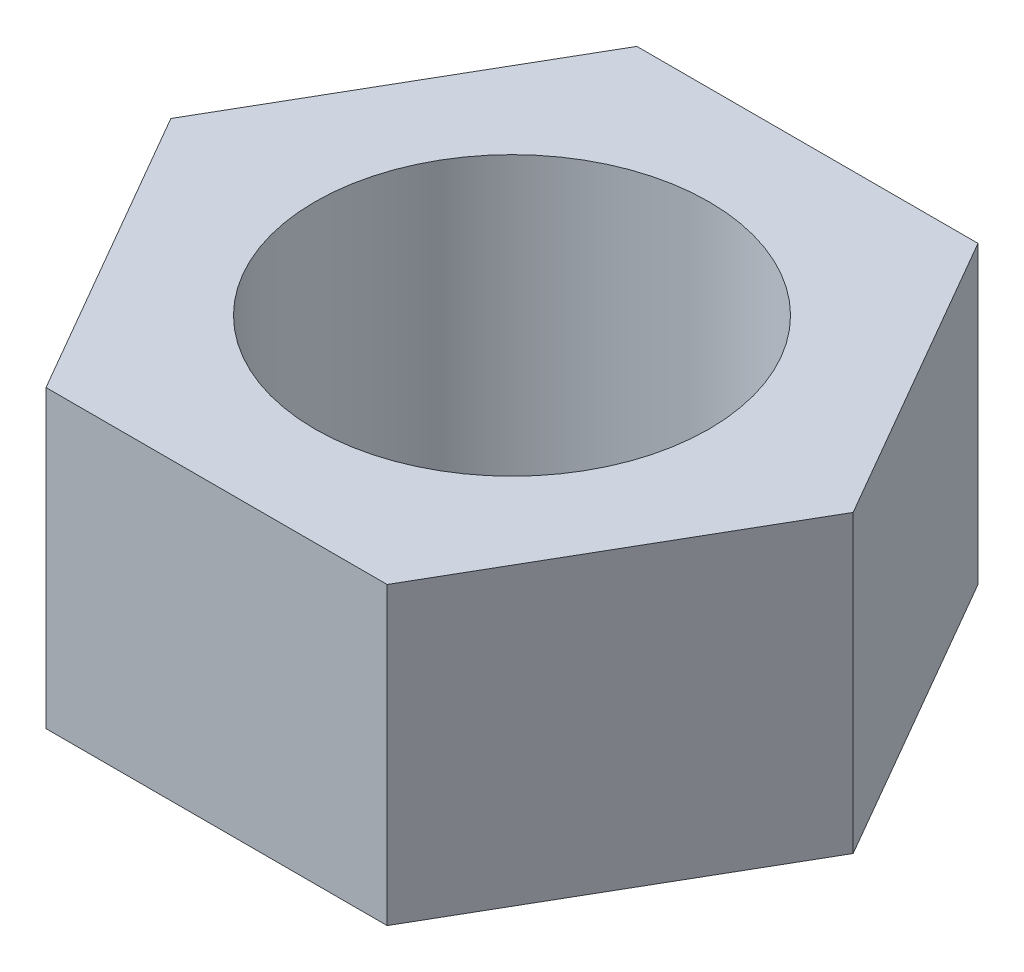
ISO-10303-21;
HEADER;
FILE_DESCRIPTION(('STEP AP214'),'2;1');
FILE_NAME('part.step','',(''),(''),'','','');
FILE_SCHEMA(('AUTOMOTIVE_DESIGN { 1 0 10303 214 1 1 1 1 }'));
ENDSEC;
DATA;
#1=APPLICATION_CONTEXT('core data for automotive mechanical design processes');
#2=APPLICATION_PROTOCOL_DEFINITION('international standard','automotive_design',2000,#1);
#3=PRODUCT_CONTEXT('',#1,'mechanical');
#4=PRODUCT('Part','Part','',(#3));
#5=PRODUCT_RELATED_PRODUCT_CATEGORY('part','',(#4));
#6=PRODUCT_DEFINITION_FORMATION('','',#4);
#7=PRODUCT_DEFINITION_CONTEXT('part definition',#1,'design');
#8=PRODUCT_DEFINITION('design','',#6,#7);
#9=PRODUCT_DEFINITION_SHAPE('','',#8);
#10=(LENGTH_UNIT() NAMED_UNIT(*) SI_UNIT(.MILLI.,.METRE.));
#11=(NAMED_UNIT(*) PLANE_ANGLE_UNIT() SI_UNIT($,.RADIAN.));
#12=(NAMED_UNIT(*) SI_UNIT($,.STERADIAN.) SOLID_ANGLE_UNIT());
#13=UNCERTAINTY_MEASURE_WITH_UNIT(LENGTH_MEASURE(1.E-05),#10,'distance_accuracy_value','');
#14=(GEOMETRIC_REPRESENTATION_CONTEXT(3) GLOBAL_UNCERTAINTY_ASSIGNED_CONTEXT((#13)) GLOBAL_UNIT_ASSIGNED_CONTEXT((#10,
#11,#12)) REPRESENTATION_CONTEXT('',''));
#15=CARTESIAN_POINT('',(0.,0.,0.));
#16=DIRECTION('',(0.,0.,1.));
#17=DIRECTION('',(1.,0.,0.));
#18=AXIS2_PLACEMENT_3D('',#15,#16,#17);
#19=CARTESIAN_POINT('',(0.,1.5,0.));
#20=DIRECTION('',(0.,1.,0.));
#21=DIRECTION('',(0.,0.,1.));
#22=AXIS2_PLACEMENT_3D('',#19,#20,#21);
#23=PLANE('',#22);
#24=DIRECTION('',(-0.5,0.,0.866025403784439));
#25=VECTOR('',#24,1.);
#26=CARTESIAN_POINT('',(-0.866025403784439,1.5,-1.5));
#27=LINE('',#26,#25);
#28=CARTESIAN_POINT('',(-0.866025403784439,1.5,-1.5));
#29=VERTEX_POINT('',#28);
#30=CARTESIAN_POINT('',(-1.73205080756888,1.5,0.));
#31=VERTEX_POINT('',#30);
#32=EDGE_CURVE('E129',#29,#31,#27,.T.);
#33=ORIENTED_EDGE('',*,*,#32,.T.);
#34=DIRECTION('',(0.5,0.,0.866025403784439));
#35=VECTOR('',#34,1.);
#36=CARTESIAN_POINT('',(-1.73205080756888,1.5,0.));
#37=LINE('',#36,#35);
#38=CARTESIAN_POINT('',(-0.866025403784439,1.5,1.5));
#39=VERTEX_POINT('',#38);
#40=EDGE_CURVE('E87',#31,#39,#37,.T.);
#41=ORIENTED_EDGE('',*,*,#40,.T.);
#42=DIRECTION('',(1.,0.,0.));
#43=VECTOR('',#42,1.);
#44=CARTESIAN_POINT('',(-0.866025403784439,1.5,1.5));
#45=LINE('',#44,#43);
#46=CARTESIAN_POINT('',(0.866025403784439,1.5,1.5));
#47=VERTEX_POINT('',#46);
#48=EDGE_CURVE('E100',#39,#47,#45,.T.);
#49=ORIENTED_EDGE('',*,*,#48,.T.);
#50=DIRECTION('',(0.499999999999999,0.,-0.866025403784439));
#51=VECTOR('',#50,1.);
#52=CARTESIAN_POINT('',(0.866025403784439,1.5,1.5));
#53=LINE('',#52,#51);
#54=CARTESIAN_POINT('',(1.73205080756888,1.5,0.));
#55=VERTEX_POINT('',#54);
#56=EDGE_CURVE('E94',#47,#55,#53,.T.);
#57=ORIENTED_EDGE('',*,*,#56,.T.);
#58=DIRECTION('',(-0.5,0.,-0.866025403784439));
#59=VECTOR('',#58,1.);
#60=CARTESIAN_POINT('',(1.73205080756888,1.5,0.));
#61=LINE('',#60,#59);
#62=CARTESIAN_POINT('',(0.866025403784437,1.5,-1.5));
#63=VERTEX_POINT('',#62);
#64=EDGE_CURVE('E98',#55,#63,#61,.T.);
#65=ORIENTED_EDGE('',*,*,#64,.T.);
#66=DIRECTION('',(-1.,0.,0.));
#67=VECTOR('',#66,1.);
#68=CARTESIAN_POINT('',(0.866025403784437,1.5,-1.5));
#69=LINE('',#68,#67);
#70=EDGE_CURVE('E50',#63,#29,#69,.T.);
#71=ORIENTED_EDGE('',*,*,#70,.T.);
#72=EDGE_LOOP('',(#33,#41,#49,#57,#65,#71));
#73=FACE_BOUND('',#72,.T.);
#74=CARTESIAN_POINT('',(0.,1.5,0.));
#75=DIRECTION('',(0.,1.,0.));
#76=DIRECTION('',(0.,0.,1.));
#77=AXIS2_PLACEMENT_3D('',#74,#75,#76);
#78=CIRCLE('',#77,1.);
#79=CARTESIAN_POINT('',(0.,1.5,1.));
#80=VERTEX_POINT('',#79);
#81=EDGE_CURVE('E122',#80,#80,#78,.T.);
#82=ORIENTED_EDGE('',*,*,#81,.F.);
#83=EDGE_LOOP('',(#82));
#84=FACE_BOUND('',#83,.T.);
#85=ADVANCED_FACE('F33',(#73,#84),#23,.T.);
#86=CARTESIAN_POINT('',(0.,0.,0.));
#87=DIRECTION('',(0.,1.,0.));
#88=DIRECTION('',(0.,0.,1.));
#89=AXIS2_PLACEMENT_3D('',#86,#87,#88);
#90=PLANE('',#89);
#91=DIRECTION('',(-0.5,0.,0.866025403784439));
#92=VECTOR('',#91,1.);
#93=CARTESIAN_POINT('',(-0.866025403784439,0.,-1.5));
#94=LINE('',#93,#92);
#95=CARTESIAN_POINT('',(-0.866025403784439,0.,-1.5));
#96=VERTEX_POINT('',#95);
#97=CARTESIAN_POINT('',(-1.73205080756888,0.,0.));
#98=VERTEX_POINT('',#97);
#99=EDGE_CURVE('E118',#96,#98,#94,.T.);
#100=ORIENTED_EDGE('',*,*,#99,.F.);
#101=DIRECTION('',(-1.,0.,0.));
#102=VECTOR('',#101,1.);
#103=CARTESIAN_POINT('',(0.866025403784437,0.,-1.5));
#104=LINE('',#103,#102);
#105=CARTESIAN_POINT('',(0.866025403784437,0.,-1.5));
#106=VERTEX_POINT('',#105);
#107=EDGE_CURVE('E79',#106,#96,#104,.T.);
#108=ORIENTED_EDGE('',*,*,#107,.F.);
#109=DIRECTION('',(-0.5,0.,-0.866025403784439));
#110=VECTOR('',#109,1.);
#111=CARTESIAN_POINT('',(1.73205080756888,0.,0.));
#112=LINE('',#111,#110);
#113=CARTESIAN_POINT('',(1.73205080756888,0.,0.));
#114=VERTEX_POINT('',#113);
#115=EDGE_CURVE('E73',#114,#106,#112,.T.);
#116=ORIENTED_EDGE('',*,*,#115,.F.);
#117=DIRECTION('',(0.499999999999999,0.,-0.866025403784439));
#118=VECTOR('',#117,1.);
#119=CARTESIAN_POINT('',(0.866025403784439,0.,1.5));
#120=LINE('',#119,#118);
#121=CARTESIAN_POINT('',(0.866025403784439,0.,1.5));
#122=VERTEX_POINT('',#121);
#123=EDGE_CURVE('E108',#122,#114,#120,.T.);
#124=ORIENTED_EDGE('',*,*,#123,.F.);
#125=DIRECTION('',(1.,0.,0.));
#126=VECTOR('',#125,1.);
#127=CARTESIAN_POINT('',(-0.866025403784439,0.,1.5));
#128=LINE('',#127,#126);
#129=CARTESIAN_POINT('',(-0.866025403784439,0.,1.5));
#130=VERTEX_POINT('',#129);
#131=EDGE_CURVE('E124',#130,#122,#128,.T.);
#132=ORIENTED_EDGE('',*,*,#131,.F.);
#133=DIRECTION('',(0.5,0.,0.866025403784439));
#134=VECTOR('',#133,1.);
#135=CARTESIAN_POINT('',(-1.73205080756888,0.,0.));
#136=LINE('',#135,#134);
#137=EDGE_CURVE('E121',#98,#130,#136,.T.);
#138=ORIENTED_EDGE('',*,*,#137,.F.);
#139=EDGE_LOOP('',(#100,#108,#116,#124,#132,#138));
#140=FACE_BOUND('',#139,.T.);
#141=CARTESIAN_POINT('',(0.,0.,0.));
#142=DIRECTION('',(0.,1.,0.));
#143=DIRECTION('',(0.,0.,1.));
#144=AXIS2_PLACEMENT_3D('',#141,#142,#143);
#145=CIRCLE('',#144,1.);
#146=CARTESIAN_POINT('',(0.,0.,1.));
#147=VERTEX_POINT('',#146);
#148=EDGE_CURVE('E222',#147,#147,#145,.T.);
#149=ORIENTED_EDGE('',*,*,#148,.T.);
#150=EDGE_LOOP('',(#149));
#151=FACE_BOUND('',#150,.T.);
#152=ADVANCED_FACE('F138',(#140,#151),#90,.F.);
#153=CARTESIAN_POINT('',(-0.866025403784439,1.5,-1.5));
#154=DIRECTION('',(0.866025403784439,0.,0.5));
#155=DIRECTION('',(0.5,0.,-0.866025403784439));
#156=AXIS2_PLACEMENT_3D('',#153,#154,#155);
#157=PLANE('',#156);
#158=ORIENTED_EDGE('',*,*,#99,.T.);
#159=DIRECTION('',(0.,-1.,0.));
#160=VECTOR('',#159,1.);
#161=CARTESIAN_POINT('',(-1.73205080756888,1.5,0.));
#162=LINE('',#161,#160);
#163=EDGE_CURVE('E11',#31,#98,#162,.T.);
#164=ORIENTED_EDGE('',*,*,#163,.F.);
#165=ORIENTED_EDGE('',*,*,#32,.F.);
#166=DIRECTION('',(0.,-1.,0.));
#167=VECTOR('',#166,1.);
#168=CARTESIAN_POINT('',(-0.866025403784439,1.5,-1.5));
#169=LINE('',#168,#167);
#170=EDGE_CURVE('E114',#29,#96,#169,.T.);
#171=ORIENTED_EDGE('',*,*,#170,.T.);
#172=EDGE_LOOP('',(#158,#164,#165,#171));
#173=FACE_BOUND('',#172,.T.);
#174=ADVANCED_FACE('F35',(#173),#157,.F.);
#175=CARTESIAN_POINT('',(-1.73205080756888,1.5,0.));
#176=DIRECTION('',(0.866025403784439,0.,-0.5));
#177=DIRECTION('',(-0.5,0.,-0.866025403784439));
#178=AXIS2_PLACEMENT_3D('',#175,#176,#177);
#179=PLANE('',#178);
#180=ORIENTED_EDGE('',*,*,#137,.T.);
#181=DIRECTION('',(0.,-1.,0.));
#182=VECTOR('',#181,1.);
#183=CARTESIAN_POINT('',(-0.866025403784439,1.5,1.5));
#184=LINE('',#183,#182);
#185=EDGE_CURVE('E42',#39,#130,#184,.T.);
#186=ORIENTED_EDGE('',*,*,#185,.F.);
#187=ORIENTED_EDGE('',*,*,#40,.F.);
#188=ORIENTED_EDGE('',*,*,#163,.T.);
#189=EDGE_LOOP('',(#180,#186,#187,#188));
#190=FACE_BOUND('',#189,.T.);
#191=ADVANCED_FACE('F163',(#190),#179,.F.);
#192=CARTESIAN_POINT('',(-0.866025403784439,1.5,1.5));
#193=DIRECTION('',(0.,0.,-1.));
#194=DIRECTION('',(-1.,0.,0.));
#195=AXIS2_PLACEMENT_3D('',#192,#193,#194);
#196=PLANE('',#195);
#197=ORIENTED_EDGE('',*,*,#131,.T.);
#198=DIRECTION('',(0.,-1.,0.));
#199=VECTOR('',#198,1.);
#200=CARTESIAN_POINT('',(0.866025403784439,1.5,1.5));
#201=LINE('',#200,#199);
#202=EDGE_CURVE('E109',#47,#122,#201,.T.);
#203=ORIENTED_EDGE('',*,*,#202,.F.);
#204=ORIENTED_EDGE('',*,*,#48,.F.);
#205=ORIENTED_EDGE('',*,*,#185,.T.);
#206=EDGE_LOOP('',(#197,#203,#204,#205));
#207=FACE_BOUND('',#206,.T.);
#208=ADVANCED_FACE('F135',(#207),#196,.F.);
#209=CARTESIAN_POINT('',(0.866025403784439,1.5,1.5));
#210=DIRECTION('',(-0.866025403784439,0.,-0.5));
#211=DIRECTION('',(-0.5,0.,0.866025403784439));
#212=AXIS2_PLACEMENT_3D('',#209,#210,#211);
#213=PLANE('',#212);
#214=ORIENTED_EDGE('',*,*,#123,.T.);
#215=DIRECTION('',(0.,-1.,0.));
#216=VECTOR('',#215,1.);
#217=CARTESIAN_POINT('',(1.73205080756888,1.5,0.));
#218=LINE('',#217,#216);
#219=EDGE_CURVE('E105',#55,#114,#218,.T.);
#220=ORIENTED_EDGE('',*,*,#219,.F.);
#221=ORIENTED_EDGE('',*,*,#56,.F.);
#222=ORIENTED_EDGE('',*,*,#202,.T.);
#223=EDGE_LOOP('',(#214,#220,#221,#222));
#224=FACE_BOUND('',#223,.T.);
#225=ADVANCED_FACE('F106',(#224),#213,.F.);
#226=CARTESIAN_POINT('',(1.73205080756888,1.5,0.));
#227=DIRECTION('',(-0.866025403784438,0.,0.5));
#228=DIRECTION('',(0.5,0.,0.866025403784439));
#229=AXIS2_PLACEMENT_3D('',#226,#227,#228);
#230=PLANE('',#229);
#231=ORIENTED_EDGE('',*,*,#115,.T.);
#232=DIRECTION('',(0.,-1.,0.));
#233=VECTOR('',#232,1.);
#234=CARTESIAN_POINT('',(0.866025403784437,1.5,-1.5));
#235=LINE('',#234,#233);
#236=EDGE_CURVE('E110',#63,#106,#235,.T.);
#237=ORIENTED_EDGE('',*,*,#236,.F.);
#238=ORIENTED_EDGE('',*,*,#64,.F.);
#239=ORIENTED_EDGE('',*,*,#219,.T.);
#240=EDGE_LOOP('',(#231,#237,#238,#239));
#241=FACE_BOUND('',#240,.T.);
#242=ADVANCED_FACE('F112',(#241),#230,.F.);
#243=CARTESIAN_POINT('',(0.866025403784437,1.5,-1.5));
#244=DIRECTION('',(0.,0.,1.));
#245=DIRECTION('',(1.,0.,0.));
#246=AXIS2_PLACEMENT_3D('',#243,#244,#245);
#247=PLANE('',#246);
#248=ORIENTED_EDGE('',*,*,#107,.T.);
#249=ORIENTED_EDGE('',*,*,#170,.F.);
#250=ORIENTED_EDGE('',*,*,#70,.F.);
#251=ORIENTED_EDGE('',*,*,#236,.T.);
#252=EDGE_LOOP('',(#248,#249,#250,#251));
#253=FACE_BOUND('',#252,.T.);
#254=ADVANCED_FACE('F143',(#253),#247,.F.);
#255=CARTESIAN_POINT('',(0.,1.5,0.));
#256=DIRECTION('',(0.,-1.,0.));
#257=DIRECTION('',(0.,0.,-1.));
#258=AXIS2_PLACEMENT_3D('',#255,#256,#257);
#259=CYLINDRICAL_SURFACE('',#258,1.);
#260=ORIENTED_EDGE('',*,*,#81,.T.);
#261=EDGE_LOOP('',(#260));
#262=FACE_BOUND('',#261,.T.);
#263=ORIENTED_EDGE('',*,*,#148,.F.);
#264=EDGE_LOOP('',(#263));
#265=FACE_BOUND('',#264,.T.);
#266=ADVANCED_FACE('F145',(#262,#265),#259,.F.);
#267=CLOSED_SHELL('',(#85,#152,#174,#191,#208,#225,#242,#254,#266));
#268=MANIFOLD_SOLID_BREP('B2',#267);
#269=ADVANCED_BREP_SHAPE_REPRESENTATION('',(#18,#268),#14);
#270=SHAPE_DEFINITION_REPRESENTATION(#9,#269);
ENDSEC;
END-ISO-10303-21;
